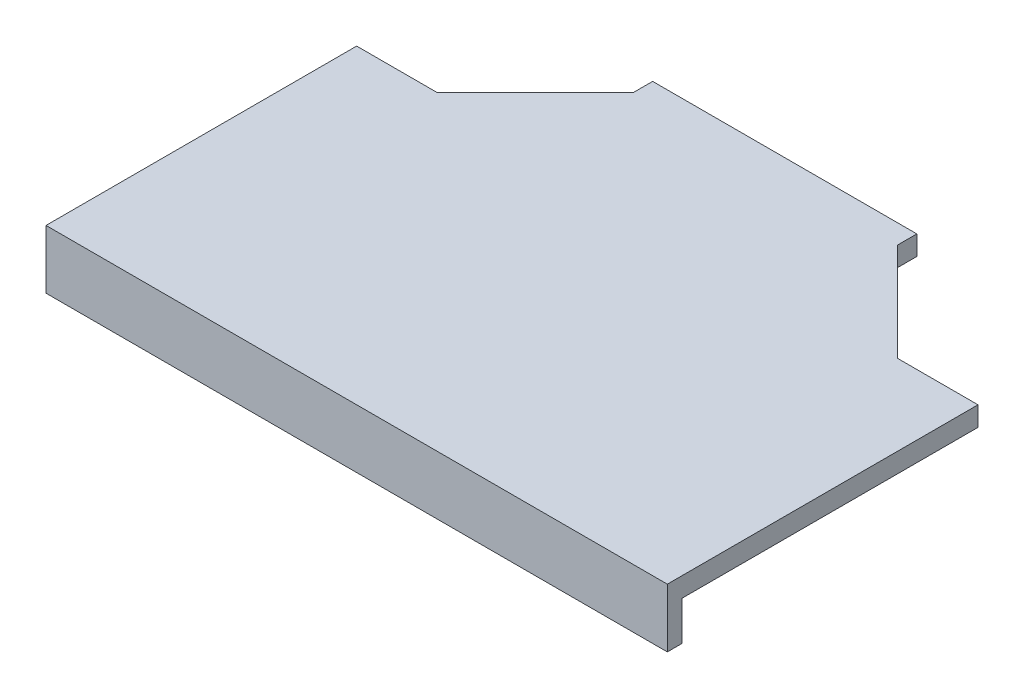
ISO-10303-21;
HEADER;
FILE_DESCRIPTION(('STEP AP214'),'2;1');
FILE_NAME('part.step','',(''),(''),'','','');
FILE_SCHEMA(('AUTOMOTIVE_DESIGN { 1 0 10303 214 1 1 1 1 }'));
ENDSEC;
DATA;
#1=APPLICATION_CONTEXT('core data for automotive mechanical design processes');
#2=APPLICATION_PROTOCOL_DEFINITION('international standard','automotive_design',2000,#1);
#3=PRODUCT_CONTEXT('',#1,'mechanical');
#4=PRODUCT('Part','Part','',(#3));
#5=PRODUCT_RELATED_PRODUCT_CATEGORY('part','',(#4));
#6=PRODUCT_DEFINITION_FORMATION('','',#4);
#7=PRODUCT_DEFINITION_CONTEXT('part definition',#1,'design');
#8=PRODUCT_DEFINITION('design','',#6,#7);
#9=PRODUCT_DEFINITION_SHAPE('','',#8);
#10=(LENGTH_UNIT() NAMED_UNIT(*) SI_UNIT(.MILLI.,.METRE.));
#11=(NAMED_UNIT(*) PLANE_ANGLE_UNIT() SI_UNIT($,.RADIAN.));
#12=(NAMED_UNIT(*) SI_UNIT($,.STERADIAN.) SOLID_ANGLE_UNIT());
#13=UNCERTAINTY_MEASURE_WITH_UNIT(LENGTH_MEASURE(1.E-05),#10,'distance_accuracy_value','');
#14=(GEOMETRIC_REPRESENTATION_CONTEXT(3) GLOBAL_UNCERTAINTY_ASSIGNED_CONTEXT((#13)) GLOBAL_UNIT_ASSIGNED_CONTEXT((#10,
#11,#12)) REPRESENTATION_CONTEXT('',''));
#15=CARTESIAN_POINT('',(0.,0.,0.));
#16=DIRECTION('',(0.,0.,1.));
#17=DIRECTION('',(1.,0.,0.));
#18=AXIS2_PLACEMENT_3D('',#15,#16,#17);
#19=CARTESIAN_POINT('',(0.,5.4,0.));
#20=DIRECTION('',(0.,1.,0.));
#21=DIRECTION('',(0.,0.,1.));
#22=AXIS2_PLACEMENT_3D('',#19,#20,#21);
#23=PLANE('',#22);
#24=DIRECTION('',(0.,0.,-1.));
#25=VECTOR('',#24,1.);
#26=CARTESIAN_POINT('',(13.5,5.4,2.));
#27=LINE('',#26,#25);
#28=CARTESIAN_POINT('',(13.5,5.4,2.));
#29=VERTEX_POINT('',#28);
#30=CARTESIAN_POINT('',(13.5,5.4,0.));
#31=VERTEX_POINT('',#30);
#32=EDGE_CURVE('E302',#29,#31,#27,.T.);
#33=ORIENTED_EDGE('',*,*,#32,.T.);
#34=DIRECTION('',(-1.,0.,0.));
#35=VECTOR('',#34,1.);
#36=CARTESIAN_POINT('',(13.5,5.4,0.));
#37=LINE('',#36,#35);
#38=CARTESIAN_POINT('',(-13.5,5.4,0.));
#39=VERTEX_POINT('',#38);
#40=EDGE_CURVE('E403',#31,#39,#37,.T.);
#41=ORIENTED_EDGE('',*,*,#40,.T.);
#42=DIRECTION('',(0.,0.,1.));
#43=VECTOR('',#42,1.);
#44=CARTESIAN_POINT('',(-13.5,5.4,2.));
#45=LINE('',#44,#43);
#46=CARTESIAN_POINT('',(-13.5,5.4,6.));
#47=VERTEX_POINT('',#46);
#48=EDGE_CURVE('E306',#39,#47,#45,.T.);
#49=ORIENTED_EDGE('',*,*,#48,.T.);
#50=DIRECTION('',(1.,0.,0.));
#51=VECTOR('',#50,1.);
#52=CARTESIAN_POINT('',(0.,5.4,6.));
#53=LINE('',#52,#51);
#54=CARTESIAN_POINT('',(6.62181717757521,5.4,6.));
#55=VERTEX_POINT('',#54);
#56=EDGE_CURVE('E298',#47,#55,#53,.T.);
#57=ORIENTED_EDGE('',*,*,#56,.T.);
#58=DIRECTION('',(0.,0.,-1.));
#59=VECTOR('',#58,1.);
#60=CARTESIAN_POINT('',(6.62181717757521,5.4,25.9027337309993));
#61=LINE('',#60,#59);
#62=CARTESIAN_POINT('',(6.62181717757521,5.4,2.));
#63=VERTEX_POINT('',#62);
#64=EDGE_CURVE('E241',#55,#63,#61,.T.);
#65=ORIENTED_EDGE('',*,*,#64,.T.);
#66=DIRECTION('',(1.,0.,0.));
#67=VECTOR('',#66,1.);
#68=CARTESIAN_POINT('',(0.,5.4,2.));
#69=LINE('',#68,#67);
#70=EDGE_CURVE('E294',#63,#29,#69,.T.);
#71=ORIENTED_EDGE('',*,*,#70,.T.);
#72=EDGE_LOOP('',(#33,#41,#49,#57,#65,#71));
#73=FACE_BOUND('',#72,.T.);
#74=DIRECTION('',(1.,0.,0.));
#75=VECTOR('',#74,1.);
#76=CARTESIAN_POINT('',(-31.75,5.4,30.25));
#77=LINE('',#76,#75);
#78=CARTESIAN_POINT('',(-31.75,5.4,30.25));
#79=VERTEX_POINT('',#78);
#80=CARTESIAN_POINT('',(31.75,5.4,30.25));
#81=VERTEX_POINT('',#80);
#82=EDGE_CURVE('E214',#79,#81,#77,.T.);
#83=ORIENTED_EDGE('',*,*,#82,.F.);
#84=DIRECTION('',(0.,0.,-1.));
#85=VECTOR('',#84,1.);
#86=CARTESIAN_POINT('',(-31.75,5.4,0.));
#87=LINE('',#86,#85);
#88=CARTESIAN_POINT('',(-31.75,5.4,0.));
#89=VERTEX_POINT('',#88);
#90=EDGE_CURVE('E218',#79,#89,#87,.T.);
#91=ORIENTED_EDGE('',*,*,#90,.T.);
#92=DIRECTION('',(1.,0.,0.));
#93=VECTOR('',#92,1.);
#94=CARTESIAN_POINT('',(31.75,5.4,0.));
#95=LINE('',#94,#93);
#96=CARTESIAN_POINT('',(-23.5,5.4,0.));
#97=VERTEX_POINT('',#96);
#98=EDGE_CURVE('E290',#89,#97,#95,.T.);
#99=ORIENTED_EDGE('',*,*,#98,.T.);
#100=DIRECTION('',(0.707106781186544,0.,-0.707106781186551));
#101=VECTOR('',#100,1.);
#102=CARTESIAN_POINT('',(-11.7500000000001,5.4,-11.75));
#103=LINE('',#102,#101);
#104=CARTESIAN_POINT('',(-13.5,5.4,-10.0000000000001));
#105=VERTEX_POINT('',#104);
#106=EDGE_CURVE('E433',#97,#105,#103,.T.);
#107=ORIENTED_EDGE('',*,*,#106,.T.);
#108=DIRECTION('',(0.,0.,1.));
#109=VECTOR('',#108,1.);
#110=CARTESIAN_POINT('',(-13.5,5.4,2.));
#111=LINE('',#110,#109);
#112=CARTESIAN_POINT('',(-13.5,5.4,-12.));
#113=VERTEX_POINT('',#112);
#114=EDGE_CURVE('E370',#113,#105,#111,.T.);
#115=ORIENTED_EDGE('',*,*,#114,.F.);
#116=DIRECTION('',(-1.,0.,0.));
#117=VECTOR('',#116,1.);
#118=CARTESIAN_POINT('',(13.5,5.4,-12.));
#119=LINE('',#118,#117);
#120=CARTESIAN_POINT('',(13.5,5.4,-12.));
#121=VERTEX_POINT('',#120);
#122=EDGE_CURVE('E380',#121,#113,#119,.T.);
#123=ORIENTED_EDGE('',*,*,#122,.F.);
#124=DIRECTION('',(0.,0.,-1.));
#125=VECTOR('',#124,1.);
#126=CARTESIAN_POINT('',(13.5,5.4,2.));
#127=LINE('',#126,#125);
#128=CARTESIAN_POINT('',(13.5,5.4,-10.0000000000001));
#129=VERTEX_POINT('',#128);
#130=EDGE_CURVE('E365',#129,#121,#127,.T.);
#131=ORIENTED_EDGE('',*,*,#130,.F.);
#132=DIRECTION('',(0.707106781186544,0.,0.707106781186551));
#133=VECTOR('',#132,1.);
#134=CARTESIAN_POINT('',(11.7500000000001,5.4,-11.75));
#135=LINE('',#134,#133);
#136=CARTESIAN_POINT('',(23.5,5.4,0.));
#137=VERTEX_POINT('',#136);
#138=EDGE_CURVE('E52',#129,#137,#135,.T.);
#139=ORIENTED_EDGE('',*,*,#138,.T.);
#140=CARTESIAN_POINT('',(31.75,5.4,0.));
#141=VERTEX_POINT('',#140);
#142=EDGE_CURVE('E66',#137,#141,#95,.T.);
#143=ORIENTED_EDGE('',*,*,#142,.T.);
#144=DIRECTION('',(0.,0.,1.));
#145=VECTOR('',#144,1.);
#146=CARTESIAN_POINT('',(31.75,5.4,31.75));
#147=LINE('',#146,#145);
#148=EDGE_CURVE('E59',#141,#81,#147,.T.);
#149=ORIENTED_EDGE('',*,*,#148,.T.);
#150=EDGE_LOOP('',(#83,#91,#99,#107,#115,#123,#131,#139,#143,#149));
#151=FACE_BOUND('',#150,.T.);
#152=ADVANCED_FACE('F43',(#73,#151),#23,.F.);
#153=CARTESIAN_POINT('',(-13.5,5.4,2.));
#154=DIRECTION('',(1.,0.,0.));
#155=DIRECTION('',(0.,0.,-1.));
#156=AXIS2_PLACEMENT_3D('',#153,#154,#155);
#157=PLANE('',#156);
#158=DIRECTION('',(0.,-1.,0.));
#159=VECTOR('',#158,1.);
#160=CARTESIAN_POINT('',(-13.5,-5.4,2.));
#161=LINE('',#160,#159);
#162=CARTESIAN_POINT('',(-13.5,1.63667899266991,2.));
#163=VERTEX_POINT('',#162);
#164=CARTESIAN_POINT('',(-13.5,-5.4,2.));
#165=VERTEX_POINT('',#164);
#166=EDGE_CURVE('E313',#163,#165,#161,.T.);
#167=ORIENTED_EDGE('',*,*,#166,.F.);
#168=DIRECTION('',(0.,0.,-1.));
#169=VECTOR('',#168,1.);
#170=CARTESIAN_POINT('',(-13.5,1.63667899266991,25.9027337309993));
#171=LINE('',#170,#169);
#172=CARTESIAN_POINT('',(-13.5,1.63667899266991,6.));
#173=VERTEX_POINT('',#172);
#174=EDGE_CURVE('E252',#173,#163,#171,.T.);
#175=ORIENTED_EDGE('',*,*,#174,.F.);
#176=DIRECTION('',(0.,-1.,0.));
#177=VECTOR('',#176,1.);
#178=CARTESIAN_POINT('',(-13.5,-5.4,6.));
#179=LINE('',#178,#177);
#180=EDGE_CURVE('E358',#47,#173,#179,.T.);
#181=ORIENTED_EDGE('',*,*,#180,.F.);
#182=ORIENTED_EDGE('',*,*,#48,.F.);
#183=DIRECTION('',(0.,-1.,0.));
#184=VECTOR('',#183,1.);
#185=CARTESIAN_POINT('',(-13.5,5.4,0.));
#186=LINE('',#185,#184);
#187=CARTESIAN_POINT('',(-13.5,-5.4,0.));
#188=VERTEX_POINT('',#187);
#189=EDGE_CURVE('E392',#39,#188,#186,.T.);
#190=ORIENTED_EDGE('',*,*,#189,.T.);
#191=DIRECTION('',(0.,0.,-1.));
#192=VECTOR('',#191,1.);
#193=CARTESIAN_POINT('',(-13.5,-5.4,2.));
#194=LINE('',#193,#192);
#195=EDGE_CURVE('E407',#165,#188,#194,.T.);
#196=ORIENTED_EDGE('',*,*,#195,.F.);
#197=EDGE_LOOP('',(#167,#175,#181,#182,#190,#196));
#198=FACE_BOUND('',#197,.T.);
#199=ADVANCED_FACE('F493',(#198),#157,.F.);
#200=CARTESIAN_POINT('',(0.,0.,6.));
#201=DIRECTION('',(0.,0.,-1.));
#202=DIRECTION('',(-1.,0.,0.));
#203=AXIS2_PLACEMENT_3D('',#200,#201,#202);
#204=PLANE('',#203);
#205=CARTESIAN_POINT('',(-13.5,-5.4,6.));
#206=DIRECTION('',(0.,0.,-1.));
#207=DIRECTION('',(-1.,0.,0.));
#208=AXIS2_PLACEMENT_3D('',#205,#206,#207);
#209=CIRCLE('',#208,7.03667899266991);
#210=CARTESIAN_POINT('',(-6.46332100733009,-5.4,6.));
#211=VERTEX_POINT('',#210);
#212=EDGE_CURVE('E234',#173,#211,#209,.T.);
#213=ORIENTED_EDGE('',*,*,#212,.T.);
#214=DIRECTION('',(1.,0.,0.));
#215=VECTOR('',#214,1.);
#216=CARTESIAN_POINT('',(-13.5,-5.4,6.));
#217=LINE('',#216,#215);
#218=CARTESIAN_POINT('',(2.32608608843066,-5.4,6.));
#219=VERTEX_POINT('',#218);
#220=EDGE_CURVE('E362',#211,#219,#217,.T.);
#221=ORIENTED_EDGE('',*,*,#220,.T.);
#222=DIRECTION('',(0.,-1.,0.));
#223=VECTOR('',#222,1.);
#224=CARTESIAN_POINT('',(2.32608608843066,-5.4,6.));
#225=LINE('',#224,#223);
#226=CARTESIAN_POINT('',(2.32608608843066,-1.12663973639826,6.));
#227=VERTEX_POINT('',#226);
#228=EDGE_CURVE('E336',#227,#219,#225,.T.);
#229=ORIENTED_EDGE('',*,*,#228,.F.);
#230=DIRECTION('',(-1.,0.,0.));
#231=VECTOR('',#230,1.);
#232=CARTESIAN_POINT('',(13.5,-1.12663973639826,6.));
#233=LINE('',#232,#231);
#234=CARTESIAN_POINT('',(6.62181717757521,-1.12663973639826,6.));
#235=VERTEX_POINT('',#234);
#236=EDGE_CURVE('E329',#235,#227,#233,.T.);
#237=ORIENTED_EDGE('',*,*,#236,.F.);
#238=DIRECTION('',(0.,1.,0.));
#239=VECTOR('',#238,1.);
#240=CARTESIAN_POINT('',(6.62181717757521,5.4,6.));
#241=LINE('',#240,#239);
#242=EDGE_CURVE('E235',#235,#55,#241,.T.);
#243=ORIENTED_EDGE('',*,*,#242,.T.);
#244=ORIENTED_EDGE('',*,*,#56,.F.);
#245=ORIENTED_EDGE('',*,*,#180,.T.);
#246=EDGE_LOOP('',(#213,#221,#229,#237,#243,#244,#245));
#247=FACE_BOUND('',#246,.T.);
#248=ADVANCED_FACE('F497',(#247),#204,.F.);
#249=CARTESIAN_POINT('',(13.5,-5.4,2.));
#250=DIRECTION('',(0.,1.,0.));
#251=DIRECTION('',(0.,0.,1.));
#252=AXIS2_PLACEMENT_3D('',#249,#250,#251);
#253=PLANE('',#252);
#254=DIRECTION('',(0.,0.,-1.));
#255=VECTOR('',#254,1.);
#256=CARTESIAN_POINT('',(-6.46332100733009,-5.4,25.9027337309993));
#257=LINE('',#256,#255);
#258=CARTESIAN_POINT('',(-6.46332100733009,-5.4,2.));
#259=VERTEX_POINT('',#258);
#260=EDGE_CURVE('E238',#259,#211,#257,.F.);
#261=ORIENTED_EDGE('',*,*,#260,.F.);
#262=DIRECTION('',(1.,0.,0.));
#263=VECTOR('',#262,1.);
#264=CARTESIAN_POINT('',(-13.5,-5.4,2.));
#265=LINE('',#264,#263);
#266=EDGE_CURVE('E310',#165,#259,#265,.T.);
#267=ORIENTED_EDGE('',*,*,#266,.F.);
#268=ORIENTED_EDGE('',*,*,#195,.T.);
#269=DIRECTION('',(1.,0.,0.));
#270=VECTOR('',#269,1.);
#271=CARTESIAN_POINT('',(13.5,-5.4,0.));
#272=LINE('',#271,#270);
#273=CARTESIAN_POINT('',(2.32608608843066,-5.4,0.));
#274=VERTEX_POINT('',#273);
#275=EDGE_CURVE('E396',#188,#274,#272,.T.);
#276=ORIENTED_EDGE('',*,*,#275,.T.);
#277=DIRECTION('',(0.,0.,1.));
#278=VECTOR('',#277,1.);
#279=CARTESIAN_POINT('',(2.32608608843066,-5.4,-12.));
#280=LINE('',#279,#278);
#281=EDGE_CURVE('E341',#274,#219,#280,.T.);
#282=ORIENTED_EDGE('',*,*,#281,.T.);
#283=ORIENTED_EDGE('',*,*,#220,.F.);
#284=EDGE_LOOP('',(#261,#267,#268,#276,#282,#283));
#285=FACE_BOUND('',#284,.T.);
#286=ADVANCED_FACE('F633',(#285),#253,.F.);
#287=CARTESIAN_POINT('',(13.5,5.4,2.));
#288=DIRECTION('',(-1.,0.,0.));
#289=DIRECTION('',(0.,0.,1.));
#290=AXIS2_PLACEMENT_3D('',#287,#288,#289);
#291=PLANE('',#290);
#292=ORIENTED_EDGE('',*,*,#32,.F.);
#293=DIRECTION('',(0.,1.,0.));
#294=VECTOR('',#293,1.);
#295=CARTESIAN_POINT('',(13.5,-1.12663973639826,2.));
#296=LINE('',#295,#294);
#297=CARTESIAN_POINT('',(13.5,-1.12663973639826,2.));
#298=VERTEX_POINT('',#297);
#299=EDGE_CURVE('E317',#298,#29,#296,.T.);
#300=ORIENTED_EDGE('',*,*,#299,.F.);
#301=DIRECTION('',(0.,0.,1.));
#302=VECTOR('',#301,1.);
#303=CARTESIAN_POINT('',(13.5,-1.12663973639826,-12.));
#304=LINE('',#303,#302);
#305=CARTESIAN_POINT('',(13.5,-1.12663973639826,0.));
#306=VERTEX_POINT('',#305);
#307=EDGE_CURVE('E340',#306,#298,#304,.T.);
#308=ORIENTED_EDGE('',*,*,#307,.F.);
#309=DIRECTION('',(0.,1.,0.));
#310=VECTOR('',#309,1.);
#311=CARTESIAN_POINT('',(13.5,5.4,0.));
#312=LINE('',#311,#310);
#313=EDGE_CURVE('E400',#306,#31,#312,.T.);
#314=ORIENTED_EDGE('',*,*,#313,.T.);
#315=EDGE_LOOP('',(#292,#300,#308,#314));
#316=FACE_BOUND('',#315,.T.);
#317=ADVANCED_FACE('F619',(#316),#291,.F.);
#318=CARTESIAN_POINT('',(0.,0.,2.));
#319=DIRECTION('',(0.,0.,-1.));
#320=DIRECTION('',(-1.,0.,0.));
#321=AXIS2_PLACEMENT_3D('',#318,#319,#320);
#322=PLANE('',#321);
#323=CARTESIAN_POINT('',(11.7,3.3,2.));
#324=DIRECTION('',(0.,0.,-1.));
#325=DIRECTION('',(-1.,0.,0.));
#326=AXIS2_PLACEMENT_3D('',#323,#324,#325);
#327=CIRCLE('',#326,1.05);
#328=CARTESIAN_POINT('',(10.65,3.3,2.));
#329=VERTEX_POINT('',#328);
#330=EDGE_CURVE('E321',#329,#329,#327,.F.);
#331=ORIENTED_EDGE('',*,*,#330,.F.);
#332=EDGE_LOOP('',(#331));
#333=FACE_BOUND('',#332,.T.);
#334=ORIENTED_EDGE('',*,*,#70,.F.);
#335=DIRECTION('',(0.,-1.,0.));
#336=VECTOR('',#335,1.);
#337=CARTESIAN_POINT('',(6.62181717757521,5.4,2.));
#338=LINE('',#337,#336);
#339=CARTESIAN_POINT('',(6.62181717757521,-1.12663973639826,2.));
#340=VERTEX_POINT('',#339);
#341=EDGE_CURVE('E220',#63,#340,#338,.T.);
#342=ORIENTED_EDGE('',*,*,#341,.T.);
#343=DIRECTION('',(1.,0.,0.));
#344=VECTOR('',#343,1.);
#345=CARTESIAN_POINT('',(13.5,-1.12663973639826,2.));
#346=LINE('',#345,#344);
#347=EDGE_CURVE('E322',#340,#298,#346,.T.);
#348=ORIENTED_EDGE('',*,*,#347,.T.);
#349=ORIENTED_EDGE('',*,*,#299,.T.);
#350=EDGE_LOOP('',(#334,#342,#348,#349));
#351=FACE_BOUND('',#350,.T.);
#352=ADVANCED_FACE('F624',(#333,#351),#322,.F.);
#353=ORIENTED_EDGE('',*,*,#114,.T.);
#354=DIRECTION('',(0.,1.,0.));
#355=VECTOR('',#354,1.);
#356=CARTESIAN_POINT('',(-13.5,5.4,-10.0000000000001));
#357=LINE('',#356,#355);
#358=CARTESIAN_POINT('',(-13.5,7.4,-10.0000000000001));
#359=VERTEX_POINT('',#358);
#360=EDGE_CURVE('E410',#105,#359,#357,.T.);
#361=ORIENTED_EDGE('',*,*,#360,.T.);
#362=DIRECTION('',(0.,0.,1.));
#363=VECTOR('',#362,1.);
#364=CARTESIAN_POINT('',(-13.5,7.4,2.));
#365=LINE('',#364,#363);
#366=CARTESIAN_POINT('',(-13.5,7.4,-12.));
#367=VERTEX_POINT('',#366);
#368=EDGE_CURVE('E373',#367,#359,#365,.T.);
#369=ORIENTED_EDGE('',*,*,#368,.F.);
#370=DIRECTION('',(0.,-1.,0.));
#371=VECTOR('',#370,1.);
#372=CARTESIAN_POINT('',(-13.5,7.4,-12.));
#373=LINE('',#372,#371);
#374=EDGE_CURVE('E377',#367,#113,#373,.T.);
#375=ORIENTED_EDGE('',*,*,#374,.T.);
#376=EDGE_LOOP('',(#353,#361,#369,#375));
#377=FACE_BOUND('',#376,.T.);
#378=ADVANCED_FACE('F469',(#377),#157,.F.);
#379=DIRECTION('',(0.,0.,-1.));
#380=VECTOR('',#379,1.);
#381=CARTESIAN_POINT('',(13.5,7.4,2.));
#382=LINE('',#381,#380);
#383=CARTESIAN_POINT('',(13.5,7.4,-10.0000000000001));
#384=VERTEX_POINT('',#383);
#385=CARTESIAN_POINT('',(13.5,7.4,-12.));
#386=VERTEX_POINT('',#385);
#387=EDGE_CURVE('E366',#384,#386,#382,.T.);
#388=ORIENTED_EDGE('',*,*,#387,.F.);
#389=DIRECTION('',(0.,-1.,0.));
#390=VECTOR('',#389,1.);
#391=CARTESIAN_POINT('',(13.5,5.4,-10.0000000000001));
#392=LINE('',#391,#390);
#393=EDGE_CURVE('E423',#384,#129,#392,.T.);
#394=ORIENTED_EDGE('',*,*,#393,.T.);
#395=ORIENTED_EDGE('',*,*,#130,.T.);
#396=DIRECTION('',(0.,-1.,0.));
#397=VECTOR('',#396,1.);
#398=CARTESIAN_POINT('',(13.5,7.4,-12.));
#399=LINE('',#398,#397);
#400=EDGE_CURVE('E388',#386,#121,#399,.T.);
#401=ORIENTED_EDGE('',*,*,#400,.F.);
#402=EDGE_LOOP('',(#388,#394,#395,#401));
#403=FACE_BOUND('',#402,.T.);
#404=ADVANCED_FACE('F477',(#403),#291,.F.);
#405=CARTESIAN_POINT('',(0.,0.,0.));
#406=DIRECTION('',(0.,0.,-1.));
#407=DIRECTION('',(-1.,0.,0.));
#408=AXIS2_PLACEMENT_3D('',#405,#406,#407);
#409=PLANE('',#408);
#410=CARTESIAN_POINT('',(-11.7,-3.3,0.));
#411=DIRECTION('',(0.,0.,-1.));
#412=DIRECTION('',(-1.,0.,0.));
#413=AXIS2_PLACEMENT_3D('',#410,#411,#412);
#414=CIRCLE('',#413,1.05);
#415=CARTESIAN_POINT('',(-12.75,-3.3,0.));
#416=VERTEX_POINT('',#415);
#417=EDGE_CURVE('E325',#416,#416,#414,.T.);
#418=ORIENTED_EDGE('',*,*,#417,.F.);
#419=EDGE_LOOP('',(#418));
#420=FACE_BOUND('',#419,.T.);
#421=CARTESIAN_POINT('',(11.7,3.3,0.));
#422=DIRECTION('',(0.,0.,-1.));
#423=DIRECTION('',(-1.,0.,0.));
#424=AXIS2_PLACEMENT_3D('',#421,#422,#423);
#425=CIRCLE('',#424,1.05);
#426=CARTESIAN_POINT('',(10.65,3.3,0.));
#427=VERTEX_POINT('',#426);
#428=EDGE_CURVE('E330',#427,#427,#425,.T.);
#429=ORIENTED_EDGE('',*,*,#428,.F.);
#430=EDGE_LOOP('',(#429));
#431=FACE_BOUND('',#430,.T.);
#432=DIRECTION('',(0.,1.,0.));
#433=VECTOR('',#432,1.);
#434=CARTESIAN_POINT('',(2.32608608843066,0.,0.));
#435=LINE('',#434,#433);
#436=CARTESIAN_POINT('',(2.32608608843066,-1.12663973639826,0.));
#437=VERTEX_POINT('',#436);
#438=EDGE_CURVE('E355',#274,#437,#435,.T.);
#439=ORIENTED_EDGE('',*,*,#438,.F.);
#440=ORIENTED_EDGE('',*,*,#275,.F.);
#441=ORIENTED_EDGE('',*,*,#189,.F.);
#442=ORIENTED_EDGE('',*,*,#40,.F.);
#443=ORIENTED_EDGE('',*,*,#313,.F.);
#444=DIRECTION('',(1.,0.,0.));
#445=VECTOR('',#444,1.);
#446=CARTESIAN_POINT('',(0.,-1.12663973639826,0.));
#447=LINE('',#446,#445);
#448=EDGE_CURVE('E345',#437,#306,#447,.T.);
#449=ORIENTED_EDGE('',*,*,#448,.F.);
#450=EDGE_LOOP('',(#439,#440,#441,#442,#443,#449));
#451=FACE_BOUND('',#450,.T.);
#452=ADVANCED_FACE('F605',(#420,#431,#451),#409,.T.);
#453=CARTESIAN_POINT('',(13.5,7.4,-12.));
#454=DIRECTION('',(0.,0.,1.));
#455=DIRECTION('',(1.,0.,0.));
#456=AXIS2_PLACEMENT_3D('',#453,#454,#455);
#457=PLANE('',#456);
#458=ORIENTED_EDGE('',*,*,#122,.T.);
#459=ORIENTED_EDGE('',*,*,#374,.F.);
#460=DIRECTION('',(-1.,0.,0.));
#461=VECTOR('',#460,1.);
#462=CARTESIAN_POINT('',(13.5,7.4,-12.));
#463=LINE('',#462,#461);
#464=EDGE_CURVE('E369',#386,#367,#463,.T.);
#465=ORIENTED_EDGE('',*,*,#464,.F.);
#466=ORIENTED_EDGE('',*,*,#400,.T.);
#467=EDGE_LOOP('',(#458,#459,#465,#466));
#468=FACE_BOUND('',#467,.T.);
#469=ADVANCED_FACE('F474',(#468),#457,.F.);
#470=CARTESIAN_POINT('',(0.,7.4,0.));
#471=DIRECTION('',(0.,1.,0.));
#472=DIRECTION('',(0.,0.,1.));
#473=AXIS2_PLACEMENT_3D('',#470,#471,#472);
#474=PLANE('',#473);
#475=DIRECTION('',(-1.,0.,0.));
#476=VECTOR('',#475,1.);
#477=CARTESIAN_POINT('',(31.75,7.4,0.));
#478=LINE('',#477,#476);
#479=CARTESIAN_POINT('',(31.75,7.4,0.));
#480=VERTEX_POINT('',#479);
#481=CARTESIAN_POINT('',(23.5,7.4,0.));
#482=VERTEX_POINT('',#481);
#483=EDGE_CURVE('E266',#480,#482,#478,.T.);
#484=ORIENTED_EDGE('',*,*,#483,.T.);
#485=DIRECTION('',(-0.707106781186544,0.,-0.707106781186551));
#486=VECTOR('',#485,1.);
#487=CARTESIAN_POINT('',(13.5,7.4,-10.0000000000001));
#488=LINE('',#487,#486);
#489=EDGE_CURVE('E12',#482,#384,#488,.T.);
#490=ORIENTED_EDGE('',*,*,#489,.T.);
#491=ORIENTED_EDGE('',*,*,#387,.T.);
#492=ORIENTED_EDGE('',*,*,#464,.T.);
#493=ORIENTED_EDGE('',*,*,#368,.T.);
#494=DIRECTION('',(-0.707106781186544,0.,0.707106781186551));
#495=VECTOR('',#494,1.);
#496=CARTESIAN_POINT('',(-13.5,7.4,-10.0000000000001));
#497=LINE('',#496,#495);
#498=CARTESIAN_POINT('',(-23.5,7.4,0.));
#499=VERTEX_POINT('',#498);
#500=EDGE_CURVE('E430',#359,#499,#497,.T.);
#501=ORIENTED_EDGE('',*,*,#500,.T.);
#502=CARTESIAN_POINT('',(-31.75,7.4,0.));
#503=VERTEX_POINT('',#502);
#504=EDGE_CURVE('E265',#499,#503,#478,.T.);
#505=ORIENTED_EDGE('',*,*,#504,.T.);
#506=DIRECTION('',(0.,0.,1.));
#507=VECTOR('',#506,1.);
#508=CARTESIAN_POINT('',(-31.75,7.4,0.));
#509=LINE('',#508,#507);
#510=CARTESIAN_POINT('',(-31.75,7.4,31.75));
#511=VERTEX_POINT('',#510);
#512=EDGE_CURVE('E270',#503,#511,#509,.T.);
#513=ORIENTED_EDGE('',*,*,#512,.T.);
#514=DIRECTION('',(1.,0.,0.));
#515=VECTOR('',#514,1.);
#516=CARTESIAN_POINT('',(-31.75,7.4,31.75));
#517=LINE('',#516,#515);
#518=CARTESIAN_POINT('',(31.75,7.4,31.75));
#519=VERTEX_POINT('',#518);
#520=EDGE_CURVE('E274',#511,#519,#517,.T.);
#521=ORIENTED_EDGE('',*,*,#520,.T.);
#522=DIRECTION('',(0.,0.,-1.));
#523=VECTOR('',#522,1.);
#524=CARTESIAN_POINT('',(31.75,7.4,31.75));
#525=LINE('',#524,#523);
#526=EDGE_CURVE('E256',#519,#480,#525,.T.);
#527=ORIENTED_EDGE('',*,*,#526,.T.);
#528=EDGE_LOOP('',(#484,#490,#491,#492,#493,#501,#505,#513,#521,#527));
#529=FACE_BOUND('',#528,.T.);
#530=ADVANCED_FACE('F446',(#529),#474,.T.);
#531=CARTESIAN_POINT('',(2.32608608843066,-5.4,-12.));
#532=DIRECTION('',(-1.,0.,0.));
#533=DIRECTION('',(0.,0.,1.));
#534=AXIS2_PLACEMENT_3D('',#531,#532,#533);
#535=PLANE('',#534);
#536=ORIENTED_EDGE('',*,*,#438,.T.);
#537=DIRECTION('',(0.,0.,1.));
#538=VECTOR('',#537,1.);
#539=CARTESIAN_POINT('',(2.32608608843066,-1.12663973639826,-12.));
#540=LINE('',#539,#538);
#541=EDGE_CURVE('E346',#437,#227,#540,.T.);
#542=ORIENTED_EDGE('',*,*,#541,.T.);
#543=ORIENTED_EDGE('',*,*,#228,.T.);
#544=ORIENTED_EDGE('',*,*,#281,.F.);
#545=EDGE_LOOP('',(#536,#542,#543,#544));
#546=FACE_BOUND('',#545,.T.);
#547=ADVANCED_FACE('F587',(#546),#535,.F.);
#548=CARTESIAN_POINT('',(13.5,-1.12663973639826,-12.));
#549=DIRECTION('',(0.,1.,0.));
#550=DIRECTION('',(0.,0.,1.));
#551=AXIS2_PLACEMENT_3D('',#548,#549,#550);
#552=PLANE('',#551);
#553=ORIENTED_EDGE('',*,*,#347,.F.);
#554=DIRECTION('',(0.,0.,-1.));
#555=VECTOR('',#554,1.);
#556=CARTESIAN_POINT('',(6.62181717757521,-1.12663973639826,25.9027337309993));
#557=LINE('',#556,#555);
#558=EDGE_CURVE('E225',#235,#340,#557,.T.);
#559=ORIENTED_EDGE('',*,*,#558,.F.);
#560=ORIENTED_EDGE('',*,*,#236,.T.);
#561=ORIENTED_EDGE('',*,*,#541,.F.);
#562=ORIENTED_EDGE('',*,*,#448,.T.);
#563=ORIENTED_EDGE('',*,*,#307,.T.);
#564=EDGE_LOOP('',(#553,#559,#560,#561,#562,#563));
#565=FACE_BOUND('',#564,.T.);
#566=ADVANCED_FACE('F579',(#565),#552,.F.);
#567=CARTESIAN_POINT('',(11.7,3.3,6.));
#568=DIRECTION('',(0.,0.,-1.));
#569=DIRECTION('',(-1.,0.,0.));
#570=AXIS2_PLACEMENT_3D('',#567,#568,#569);
#571=CYLINDRICAL_SURFACE('',#570,1.05);
#572=ORIENTED_EDGE('',*,*,#330,.T.);
#573=EDGE_LOOP('',(#572));
#574=FACE_BOUND('',#573,.T.);
#575=ORIENTED_EDGE('',*,*,#428,.T.);
#576=EDGE_LOOP('',(#575));
#577=FACE_BOUND('',#576,.T.);
#578=ADVANCED_FACE('F571',(#574,#577),#571,.F.);
#579=CARTESIAN_POINT('',(-11.7,-3.3,6.));
#580=DIRECTION('',(0.,0.,-1.));
#581=DIRECTION('',(-1.,0.,0.));
#582=AXIS2_PLACEMENT_3D('',#579,#580,#581);
#583=CYLINDRICAL_SURFACE('',#582,1.05);
#584=CARTESIAN_POINT('',(-11.7,-3.3,2.));
#585=DIRECTION('',(0.,0.,-1.));
#586=DIRECTION('',(-1.,0.,0.));
#587=AXIS2_PLACEMENT_3D('',#584,#585,#586);
#588=CIRCLE('',#587,1.05);
#589=CARTESIAN_POINT('',(-12.75,-3.3,2.));
#590=VERTEX_POINT('',#589);
#591=EDGE_CURVE('E316',#590,#590,#588,.F.);
#592=ORIENTED_EDGE('',*,*,#591,.T.);
#593=EDGE_LOOP('',(#592));
#594=FACE_BOUND('',#593,.T.);
#595=ORIENTED_EDGE('',*,*,#417,.T.);
#596=EDGE_LOOP('',(#595));
#597=FACE_BOUND('',#596,.T.);
#598=ADVANCED_FACE('F563',(#594,#597),#583,.F.);
#599=CARTESIAN_POINT('',(0.,0.,2.));
#600=DIRECTION('',(0.,0.,-1.));
#601=DIRECTION('',(-1.,0.,0.));
#602=AXIS2_PLACEMENT_3D('',#599,#600,#601);
#603=PLANE('',#602);
#604=ORIENTED_EDGE('',*,*,#166,.T.);
#605=ORIENTED_EDGE('',*,*,#266,.T.);
#606=CARTESIAN_POINT('',(-13.5,-5.4,2.));
#607=DIRECTION('',(0.,0.,1.));
#608=DIRECTION('',(1.,0.,0.));
#609=AXIS2_PLACEMENT_3D('',#606,#607,#608);
#610=CIRCLE('',#609,7.03667899266991);
#611=EDGE_CURVE('E230',#259,#163,#610,.T.);
#612=ORIENTED_EDGE('',*,*,#611,.T.);
#613=EDGE_LOOP('',(#604,#605,#612));
#614=FACE_BOUND('',#613,.T.);
#615=ORIENTED_EDGE('',*,*,#591,.F.);
#616=EDGE_LOOP('',(#615));
#617=FACE_BOUND('',#616,.T.);
#618=ADVANCED_FACE('F558',(#614,#617),#603,.F.);
#619=CARTESIAN_POINT('',(31.75,-65.5951582856183,0.));
#620=DIRECTION('',(0.,0.,-1.));
#621=DIRECTION('',(-1.,0.,0.));
#622=AXIS2_PLACEMENT_3D('',#619,#620,#621);
#623=PLANE('',#622);
#624=ORIENTED_EDGE('',*,*,#504,.F.);
#625=DIRECTION('',(0.,-1.,0.));
#626=VECTOR('',#625,1.);
#627=CARTESIAN_POINT('',(-23.5,-65.5951582856183,0.));
#628=LINE('',#627,#626);
#629=EDGE_CURVE('E420',#499,#97,#628,.T.);
#630=ORIENTED_EDGE('',*,*,#629,.T.);
#631=ORIENTED_EDGE('',*,*,#98,.F.);
#632=DIRECTION('',(0.,1.,0.));
#633=VECTOR('',#632,1.);
#634=CARTESIAN_POINT('',(-31.75,-65.5951582856183,0.));
#635=LINE('',#634,#633);
#636=EDGE_CURVE('E284',#89,#503,#635,.T.);
#637=ORIENTED_EDGE('',*,*,#636,.T.);
#638=EDGE_LOOP('',(#624,#630,#631,#637));
#639=FACE_BOUND('',#638,.T.);
#640=ADVANCED_FACE('F462',(#639),#623,.T.);
#641=ORIENTED_EDGE('',*,*,#142,.F.);
#642=DIRECTION('',(0.,1.,0.));
#643=VECTOR('',#642,1.);
#644=CARTESIAN_POINT('',(23.5,-65.5951582856183,0.));
#645=LINE('',#644,#643);
#646=EDGE_CURVE('E427',#137,#482,#645,.T.);
#647=ORIENTED_EDGE('',*,*,#646,.T.);
#648=ORIENTED_EDGE('',*,*,#483,.F.);
#649=DIRECTION('',(0.,1.,0.));
#650=VECTOR('',#649,1.);
#651=CARTESIAN_POINT('',(31.75,-65.5951582856183,0.));
#652=LINE('',#651,#650);
#653=EDGE_CURVE('E278',#141,#480,#652,.T.);
#654=ORIENTED_EDGE('',*,*,#653,.F.);
#655=EDGE_LOOP('',(#641,#647,#648,#654));
#656=FACE_BOUND('',#655,.T.);
#657=ADVANCED_FACE('F444',(#656),#623,.T.);
#658=CARTESIAN_POINT('',(31.75,-65.5951582856183,31.75));
#659=DIRECTION('',(1.,0.,0.));
#660=DIRECTION('',(0.,0.,-1.));
#661=AXIS2_PLACEMENT_3D('',#658,#659,#660);
#662=PLANE('',#661);
#663=ORIENTED_EDGE('',*,*,#148,.F.);
#664=ORIENTED_EDGE('',*,*,#653,.T.);
#665=ORIENTED_EDGE('',*,*,#526,.F.);
#666=DIRECTION('',(0.,1.,0.));
#667=VECTOR('',#666,1.);
#668=CARTESIAN_POINT('',(31.75,-65.5951582856183,31.75));
#669=LINE('',#668,#667);
#670=CARTESIAN_POINT('',(31.75,1.4,31.75));
#671=VERTEX_POINT('',#670);
#672=EDGE_CURVE('E259',#671,#519,#669,.T.);
#673=ORIENTED_EDGE('',*,*,#672,.F.);
#674=DIRECTION('',(0.,0.,1.));
#675=VECTOR('',#674,1.);
#676=CARTESIAN_POINT('',(31.75,1.4,31.75));
#677=LINE('',#676,#675);
#678=CARTESIAN_POINT('',(31.75,1.4,30.25));
#679=VERTEX_POINT('',#678);
#680=EDGE_CURVE('E204',#679,#671,#677,.T.);
#681=ORIENTED_EDGE('',*,*,#680,.F.);
#682=DIRECTION('',(0.,1.,0.));
#683=VECTOR('',#682,1.);
#684=CARTESIAN_POINT('',(31.75,1.4,30.25));
#685=LINE('',#684,#683);
#686=EDGE_CURVE('E199',#679,#81,#685,.T.);
#687=ORIENTED_EDGE('',*,*,#686,.T.);
#688=EDGE_LOOP('',(#663,#664,#665,#673,#681,#687));
#689=FACE_BOUND('',#688,.T.);
#690=ADVANCED_FACE('F451',(#689),#662,.T.);
#691=CARTESIAN_POINT('',(-31.75,-65.5951582856183,31.75));
#692=DIRECTION('',(0.,0.,1.));
#693=DIRECTION('',(1.,0.,0.));
#694=AXIS2_PLACEMENT_3D('',#691,#692,#693);
#695=PLANE('',#694);
#696=DIRECTION('',(0.,1.,0.));
#697=VECTOR('',#696,1.);
#698=CARTESIAN_POINT('',(-31.75,-65.5951582856183,31.75));
#699=LINE('',#698,#697);
#700=CARTESIAN_POINT('',(-31.75,1.4,31.75));
#701=VERTEX_POINT('',#700);
#702=EDGE_CURVE('E281',#701,#511,#699,.T.);
#703=ORIENTED_EDGE('',*,*,#702,.F.);
#704=DIRECTION('',(-1.,0.,0.));
#705=VECTOR('',#704,1.);
#706=CARTESIAN_POINT('',(-31.75,1.4,31.75));
#707=LINE('',#706,#705);
#708=EDGE_CURVE('E211',#671,#701,#707,.T.);
#709=ORIENTED_EDGE('',*,*,#708,.F.);
#710=ORIENTED_EDGE('',*,*,#672,.T.);
#711=ORIENTED_EDGE('',*,*,#520,.F.);
#712=EDGE_LOOP('',(#703,#709,#710,#711));
#713=FACE_BOUND('',#712,.T.);
#714=ADVANCED_FACE('F481',(#713),#695,.T.);
#715=CARTESIAN_POINT('',(-31.75,-65.5951582856183,0.));
#716=DIRECTION('',(-1.,0.,0.));
#717=DIRECTION('',(0.,0.,1.));
#718=AXIS2_PLACEMENT_3D('',#715,#716,#717);
#719=PLANE('',#718);
#720=ORIENTED_EDGE('',*,*,#90,.F.);
#721=DIRECTION('',(0.,1.,0.));
#722=VECTOR('',#721,1.);
#723=CARTESIAN_POINT('',(-31.75,1.4,30.25));
#724=LINE('',#723,#722);
#725=CARTESIAN_POINT('',(-31.75,1.4,30.25));
#726=VERTEX_POINT('',#725);
#727=EDGE_CURVE('E197',#726,#79,#724,.T.);
#728=ORIENTED_EDGE('',*,*,#727,.F.);
#729=DIRECTION('',(0.,0.,-1.));
#730=VECTOR('',#729,1.);
#731=CARTESIAN_POINT('',(-31.75,1.4,31.75));
#732=LINE('',#731,#730);
#733=EDGE_CURVE('E205',#701,#726,#732,.T.);
#734=ORIENTED_EDGE('',*,*,#733,.F.);
#735=ORIENTED_EDGE('',*,*,#702,.T.);
#736=ORIENTED_EDGE('',*,*,#512,.F.);
#737=ORIENTED_EDGE('',*,*,#636,.F.);
#738=EDGE_LOOP('',(#720,#728,#734,#735,#736,#737));
#739=FACE_BOUND('',#738,.T.);
#740=ADVANCED_FACE('F216',(#739),#719,.T.);
#741=CARTESIAN_POINT('',(6.62181717757521,5.4,25.9027337309993));
#742=DIRECTION('',(1.,0.,0.));
#743=DIRECTION('',(0.,0.,-1.));
#744=AXIS2_PLACEMENT_3D('',#741,#742,#743);
#745=PLANE('',#744);
#746=ORIENTED_EDGE('',*,*,#558,.T.);
#747=ORIENTED_EDGE('',*,*,#341,.F.);
#748=ORIENTED_EDGE('',*,*,#64,.F.);
#749=ORIENTED_EDGE('',*,*,#242,.F.);
#750=EDGE_LOOP('',(#746,#747,#748,#749));
#751=FACE_BOUND('',#750,.T.);
#752=ADVANCED_FACE('F488',(#751),#745,.T.);
#753=CARTESIAN_POINT('',(-13.5,-5.4,25.9027337309993));
#754=DIRECTION('',(0.,0.,-1.));
#755=DIRECTION('',(-1.,0.,0.));
#756=AXIS2_PLACEMENT_3D('',#753,#754,#755);
#757=CYLINDRICAL_SURFACE('',#756,7.03667899266991);
#758=ORIENTED_EDGE('',*,*,#174,.T.);
#759=ORIENTED_EDGE('',*,*,#611,.F.);
#760=ORIENTED_EDGE('',*,*,#260,.T.);
#761=ORIENTED_EDGE('',*,*,#212,.F.);
#762=EDGE_LOOP('',(#758,#759,#760,#761));
#763=FACE_BOUND('',#762,.T.);
#764=ADVANCED_FACE('F503',(#763),#757,.F.);
#765=CARTESIAN_POINT('',(-13.5,5.4,-10.0000000000001));
#766=DIRECTION('',(0.707106781186551,0.,0.707106781186544));
#767=DIRECTION('',(0.,1.,0.));
#768=AXIS2_PLACEMENT_3D('',#765,#766,#767);
#769=PLANE('',#768);
#770=ORIENTED_EDGE('',*,*,#106,.F.);
#771=ORIENTED_EDGE('',*,*,#629,.F.);
#772=ORIENTED_EDGE('',*,*,#500,.F.);
#773=ORIENTED_EDGE('',*,*,#360,.F.);
#774=EDGE_LOOP('',(#770,#771,#772,#773));
#775=FACE_BOUND('',#774,.T.);
#776=ADVANCED_FACE('F465',(#775),#769,.F.);
#777=CARTESIAN_POINT('',(13.5,5.4,-10.0000000000001));
#778=DIRECTION('',(-0.707106781186551,0.,0.707106781186544));
#779=DIRECTION('',(0.,-1.,0.));
#780=AXIS2_PLACEMENT_3D('',#777,#778,#779);
#781=PLANE('',#780);
#782=ORIENTED_EDGE('',*,*,#489,.F.);
#783=ORIENTED_EDGE('',*,*,#646,.F.);
#784=ORIENTED_EDGE('',*,*,#138,.F.);
#785=ORIENTED_EDGE('',*,*,#393,.F.);
#786=EDGE_LOOP('',(#782,#783,#784,#785));
#787=FACE_BOUND('',#786,.T.);
#788=ADVANCED_FACE('F45',(#787),#781,.F.);
#789=CARTESIAN_POINT('',(-31.75,1.4,30.25));
#790=DIRECTION('',(0.,0.,1.));
#791=DIRECTION('',(1.,0.,0.));
#792=AXIS2_PLACEMENT_3D('',#789,#790,#791);
#793=PLANE('',#792);
#794=ORIENTED_EDGE('',*,*,#82,.T.);
#795=ORIENTED_EDGE('',*,*,#686,.F.);
#796=DIRECTION('',(1.,0.,0.));
#797=VECTOR('',#796,1.);
#798=CARTESIAN_POINT('',(-31.75,1.4,30.25));
#799=LINE('',#798,#797);
#800=EDGE_CURVE('E193',#726,#679,#799,.T.);
#801=ORIENTED_EDGE('',*,*,#800,.F.);
#802=ORIENTED_EDGE('',*,*,#727,.T.);
#803=EDGE_LOOP('',(#794,#795,#801,#802));
#804=FACE_BOUND('',#803,.T.);
#805=ADVANCED_FACE('F195',(#804),#793,.F.);
#806=CARTESIAN_POINT('',(0.,1.4,0.));
#807=DIRECTION('',(0.,-1.,0.));
#808=DIRECTION('',(0.,0.,-1.));
#809=AXIS2_PLACEMENT_3D('',#806,#807,#808);
#810=PLANE('',#809);
#811=ORIENTED_EDGE('',*,*,#733,.T.);
#812=ORIENTED_EDGE('',*,*,#800,.T.);
#813=ORIENTED_EDGE('',*,*,#680,.T.);
#814=ORIENTED_EDGE('',*,*,#708,.T.);
#815=EDGE_LOOP('',(#811,#812,#813,#814));
#816=FACE_BOUND('',#815,.T.);
#817=ADVANCED_FACE('F209',(#816),#810,.T.);
#818=CLOSED_SHELL('',(#152,#199,#248,#286,#317,#352,#378,#404,#452,#469,#530,#547,#566,#578,
#598,#618,#640,#657,#690,#714,#740,#752,#764,#776,#788,#805,#817));
#819=MANIFOLD_SOLID_BREP('B2',#818);
#820=ADVANCED_BREP_SHAPE_REPRESENTATION('',(#18,#819),#14);
#821=SHAPE_DEFINITION_REPRESENTATION(#9,#820);
ENDSEC;
END-ISO-10303-21;
